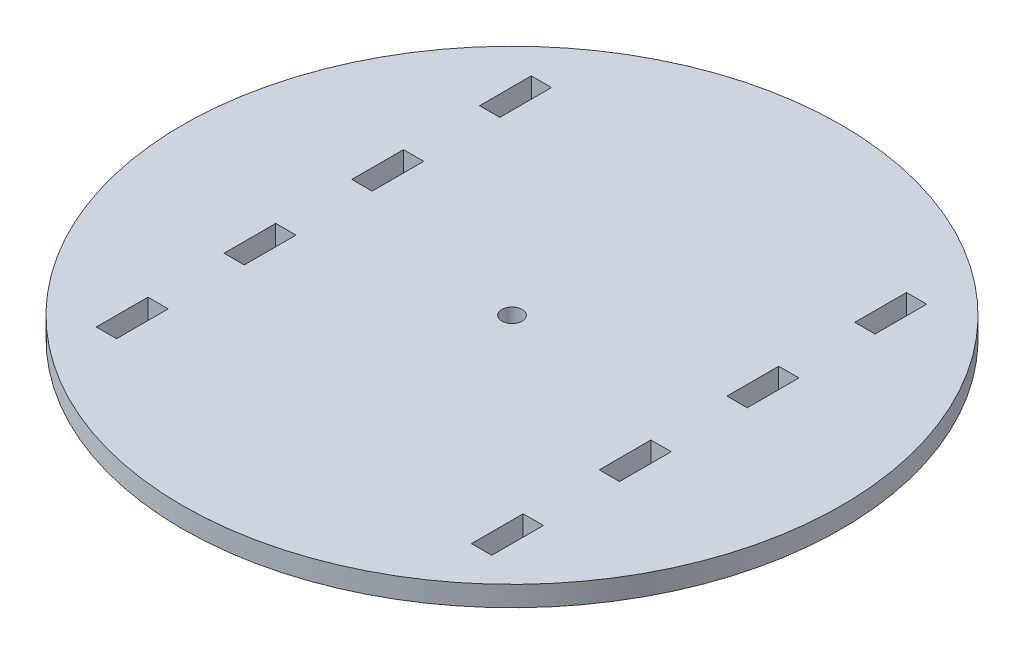
ISO-10303-21;
HEADER;
FILE_DESCRIPTION(('STEP AP214'),'2;1');
FILE_NAME('part.step','',(''),(''),'','','');
FILE_SCHEMA(('AUTOMOTIVE_DESIGN { 1 0 10303 214 1 1 1 1 }'));
ENDSEC;
DATA;
#1=APPLICATION_CONTEXT('core data for automotive mechanical design processes');
#2=APPLICATION_PROTOCOL_DEFINITION('international standard','automotive_design',2000,#1);
#3=PRODUCT_CONTEXT('',#1,'mechanical');
#4=PRODUCT('Part','Part','',(#3));
#5=PRODUCT_RELATED_PRODUCT_CATEGORY('part','',(#4));
#6=PRODUCT_DEFINITION_FORMATION('','',#4);
#7=PRODUCT_DEFINITION_CONTEXT('part definition',#1,'design');
#8=PRODUCT_DEFINITION('design','',#6,#7);
#9=PRODUCT_DEFINITION_SHAPE('','',#8);
#10=(LENGTH_UNIT() NAMED_UNIT(*) SI_UNIT(.MILLI.,.METRE.));
#11=(NAMED_UNIT(*) PLANE_ANGLE_UNIT() SI_UNIT($,.RADIAN.));
#12=(NAMED_UNIT(*) SI_UNIT($,.STERADIAN.) SOLID_ANGLE_UNIT());
#13=UNCERTAINTY_MEASURE_WITH_UNIT(LENGTH_MEASURE(1.E-05),#10,'distance_accuracy_value','');
#14=(GEOMETRIC_REPRESENTATION_CONTEXT(3) GLOBAL_UNCERTAINTY_ASSIGNED_CONTEXT((#13)) GLOBAL_UNIT_ASSIGNED_CONTEXT((#10,
#11,#12)) REPRESENTATION_CONTEXT('',''));
#15=CARTESIAN_POINT('',(0.,0.,0.));
#16=DIRECTION('',(0.,0.,1.));
#17=DIRECTION('',(1.,0.,0.));
#18=AXIS2_PLACEMENT_3D('',#15,#16,#17);
#19=CARTESIAN_POINT('',(0.,4.,0.));
#20=DIRECTION('',(0.,-1.,0.));
#21=DIRECTION('',(0.,0.,-1.));
#22=AXIS2_PLACEMENT_3D('',#19,#20,#21);
#23=CYLINDRICAL_SURFACE('',#22,65.);
#24=CARTESIAN_POINT('',(0.,4.,0.));
#25=DIRECTION('',(0.,1.,0.));
#26=DIRECTION('',(0.,0.,1.));
#27=AXIS2_PLACEMENT_3D('',#24,#25,#26);
#28=CIRCLE('',#27,65.);
#29=CARTESIAN_POINT('',(0.,4.,65.));
#30=VERTEX_POINT('',#29);
#31=EDGE_CURVE('E11',#30,#30,#28,.T.);
#32=ORIENTED_EDGE('',*,*,#31,.F.);
#33=EDGE_LOOP('',(#32));
#34=FACE_BOUND('',#33,.T.);
#35=CARTESIAN_POINT('',(0.,0.,0.));
#36=DIRECTION('',(0.,1.,0.));
#37=DIRECTION('',(0.,0.,1.));
#38=AXIS2_PLACEMENT_3D('',#35,#36,#37);
#39=CIRCLE('',#38,65.);
#40=CARTESIAN_POINT('',(0.,0.,65.));
#41=VERTEX_POINT('',#40);
#42=EDGE_CURVE('E47',#41,#41,#39,.T.);
#43=ORIENTED_EDGE('',*,*,#42,.T.);
#44=EDGE_LOOP('',(#43));
#45=FACE_BOUND('',#44,.T.);
#46=ADVANCED_FACE('F38',(#34,#45),#23,.T.);
#47=CARTESIAN_POINT('',(0.,4.,0.));
#48=DIRECTION('',(0.,1.,0.));
#49=DIRECTION('',(0.,0.,1.));
#50=AXIS2_PLACEMENT_3D('',#47,#48,#49);
#51=PLANE('',#50);
#52=CARTESIAN_POINT('',(0.,4.,0.));
#53=DIRECTION('',(0.,1.,0.));
#54=DIRECTION('',(0.,0.,1.));
#55=AXIS2_PLACEMENT_3D('',#52,#53,#54);
#56=CIRCLE('',#55,2.);
#57=CARTESIAN_POINT('',(0.,4.,2.));
#58=VERTEX_POINT('',#57);
#59=EDGE_CURVE('E959',#58,#58,#56,.T.);
#60=ORIENTED_EDGE('',*,*,#59,.F.);
#61=EDGE_LOOP('',(#60));
#62=FACE_BOUND('',#61,.T.);
#63=DIRECTION('',(0.,0.,1.));
#64=VECTOR('',#63,1.);
#65=CARTESIAN_POINT('',(-39.,4.,17.8));
#66=LINE('',#65,#64);
#67=CARTESIAN_POINT('',(-39.,4.,7.60000000000001));
#68=VERTEX_POINT('',#67);
#69=CARTESIAN_POINT('',(-39.,4.,17.8));
#70=VERTEX_POINT('',#69);
#71=EDGE_CURVE('E55',#68,#70,#66,.T.);
#72=ORIENTED_EDGE('',*,*,#71,.F.);
#73=DIRECTION('',(-1.,0.,0.));
#74=VECTOR('',#73,1.);
#75=CARTESIAN_POINT('',(-39.,4.,7.60000000000001));
#76=LINE('',#75,#74);
#77=CARTESIAN_POINT('',(-35.,4.,7.60000000000001));
#78=VERTEX_POINT('',#77);
#79=EDGE_CURVE('E412',#78,#68,#76,.T.);
#80=ORIENTED_EDGE('',*,*,#79,.F.);
#81=DIRECTION('',(0.,0.,-1.));
#82=VECTOR('',#81,1.);
#83=CARTESIAN_POINT('',(-35.,4.,7.60000000000001));
#84=LINE('',#83,#82);
#85=CARTESIAN_POINT('',(-35.,4.,17.8));
#86=VERTEX_POINT('',#85);
#87=EDGE_CURVE('E408',#86,#78,#84,.T.);
#88=ORIENTED_EDGE('',*,*,#87,.F.);
#89=DIRECTION('',(1.,0.,0.));
#90=VECTOR('',#89,1.);
#91=CARTESIAN_POINT('',(-35.,4.,17.8));
#92=LINE('',#91,#90);
#93=EDGE_CURVE('E404',#70,#86,#92,.T.);
#94=ORIENTED_EDGE('',*,*,#93,.F.);
#95=EDGE_LOOP('',(#72,#80,#88,#94));
#96=FACE_BOUND('',#95,.T.);
#97=DIRECTION('',(0.,0.,1.));
#98=VECTOR('',#97,1.);
#99=CARTESIAN_POINT('',(-39.,4.,43.));
#100=LINE('',#99,#98);
#101=CARTESIAN_POINT('',(-39.,4.,32.8));
#102=VERTEX_POINT('',#101);
#103=CARTESIAN_POINT('',(-39.,4.,43.));
#104=VERTEX_POINT('',#103);
#105=EDGE_CURVE('E63',#102,#104,#100,.T.);
#106=ORIENTED_EDGE('',*,*,#105,.F.);
#107=DIRECTION('',(-1.,0.,0.));
#108=VECTOR('',#107,1.);
#109=CARTESIAN_POINT('',(-39.,4.,32.8));
#110=LINE('',#109,#108);
#111=CARTESIAN_POINT('',(-35.,4.,32.8));
#112=VERTEX_POINT('',#111);
#113=EDGE_CURVE('E455',#112,#102,#110,.T.);
#114=ORIENTED_EDGE('',*,*,#113,.F.);
#115=DIRECTION('',(0.,0.,-1.));
#116=VECTOR('',#115,1.);
#117=CARTESIAN_POINT('',(-35.,4.,32.8));
#118=LINE('',#117,#116);
#119=CARTESIAN_POINT('',(-35.,4.,43.));
#120=VERTEX_POINT('',#119);
#121=EDGE_CURVE('E451',#120,#112,#118,.T.);
#122=ORIENTED_EDGE('',*,*,#121,.F.);
#123=DIRECTION('',(1.,0.,0.));
#124=VECTOR('',#123,1.);
#125=CARTESIAN_POINT('',(-35.,4.,43.));
#126=LINE('',#125,#124);
#127=EDGE_CURVE('E447',#104,#120,#126,.T.);
#128=ORIENTED_EDGE('',*,*,#127,.F.);
#129=EDGE_LOOP('',(#106,#114,#122,#128));
#130=FACE_BOUND('',#129,.T.);
#131=DIRECTION('',(0.,0.,1.));
#132=VECTOR('',#131,1.);
#133=CARTESIAN_POINT('',(-39.,4.,-32.6));
#134=LINE('',#133,#132);
#135=CARTESIAN_POINT('',(-39.,4.,-42.8));
#136=VERTEX_POINT('',#135);
#137=CARTESIAN_POINT('',(-39.,4.,-32.6));
#138=VERTEX_POINT('',#137);
#139=EDGE_CURVE('E486',#136,#138,#134,.T.);
#140=ORIENTED_EDGE('',*,*,#139,.F.);
#141=DIRECTION('',(-1.,0.,0.));
#142=VECTOR('',#141,1.);
#143=CARTESIAN_POINT('',(-39.,4.,-42.8));
#144=LINE('',#143,#142);
#145=CARTESIAN_POINT('',(-35.,4.,-42.8));
#146=VERTEX_POINT('',#145);
#147=EDGE_CURVE('E497',#146,#136,#144,.T.);
#148=ORIENTED_EDGE('',*,*,#147,.F.);
#149=DIRECTION('',(0.,0.,-1.));
#150=VECTOR('',#149,1.);
#151=CARTESIAN_POINT('',(-35.,4.,-42.8));
#152=LINE('',#151,#150);
#153=CARTESIAN_POINT('',(-35.,4.,-32.6));
#154=VERTEX_POINT('',#153);
#155=EDGE_CURVE('E493',#154,#146,#152,.T.);
#156=ORIENTED_EDGE('',*,*,#155,.F.);
#157=DIRECTION('',(1.,0.,0.));
#158=VECTOR('',#157,1.);
#159=CARTESIAN_POINT('',(-35.,4.,-32.6));
#160=LINE('',#159,#158);
#161=EDGE_CURVE('E489',#138,#154,#160,.T.);
#162=ORIENTED_EDGE('',*,*,#161,.F.);
#163=EDGE_LOOP('',(#140,#148,#156,#162));
#164=FACE_BOUND('',#163,.T.);
#165=DIRECTION('',(0.,0.,1.));
#166=VECTOR('',#165,1.);
#167=CARTESIAN_POINT('',(35.,4.,-42.8));
#168=LINE('',#167,#166);
#169=CARTESIAN_POINT('',(35.,4.,-42.8));
#170=VERTEX_POINT('',#169);
#171=CARTESIAN_POINT('',(35.,4.,-32.6));
#172=VERTEX_POINT('',#171);
#173=EDGE_CURVE('E527',#170,#172,#168,.T.);
#174=ORIENTED_EDGE('',*,*,#173,.F.);
#175=DIRECTION('',(-1.,0.,0.));
#176=VECTOR('',#175,1.);
#177=CARTESIAN_POINT('',(39.,4.,-42.8));
#178=LINE('',#177,#176);
#179=CARTESIAN_POINT('',(39.,4.,-42.8));
#180=VERTEX_POINT('',#179);
#181=EDGE_CURVE('E538',#180,#170,#178,.T.);
#182=ORIENTED_EDGE('',*,*,#181,.F.);
#183=DIRECTION('',(0.,0.,-1.));
#184=VECTOR('',#183,1.);
#185=CARTESIAN_POINT('',(39.,4.,-32.6));
#186=LINE('',#185,#184);
#187=CARTESIAN_POINT('',(39.,4.,-32.6));
#188=VERTEX_POINT('',#187);
#189=EDGE_CURVE('E534',#188,#180,#186,.T.);
#190=ORIENTED_EDGE('',*,*,#189,.F.);
#191=DIRECTION('',(1.,0.,0.));
#192=VECTOR('',#191,1.);
#193=CARTESIAN_POINT('',(35.,4.,-32.6));
#194=LINE('',#193,#192);
#195=EDGE_CURVE('E530',#172,#188,#194,.T.);
#196=ORIENTED_EDGE('',*,*,#195,.F.);
#197=EDGE_LOOP('',(#174,#182,#190,#196));
#198=FACE_BOUND('',#197,.T.);
#199=DIRECTION('',(0.,0.,1.));
#200=VECTOR('',#199,1.);
#201=CARTESIAN_POINT('',(35.,4.,-7.39999999999999));
#202=LINE('',#201,#200);
#203=CARTESIAN_POINT('',(35.,4.,-17.6));
#204=VERTEX_POINT('',#203);
#205=CARTESIAN_POINT('',(35.,4.,-7.39999999999999));
#206=VERTEX_POINT('',#205);
#207=EDGE_CURVE('E256',#204,#206,#202,.T.);
#208=ORIENTED_EDGE('',*,*,#207,.F.);
#209=DIRECTION('',(-1.,0.,0.));
#210=VECTOR('',#209,1.);
#211=CARTESIAN_POINT('',(35.,4.,-17.6));
#212=LINE('',#211,#210);
#213=CARTESIAN_POINT('',(39.,4.,-17.6));
#214=VERTEX_POINT('',#213);
#215=EDGE_CURVE('E262',#214,#204,#212,.T.);
#216=ORIENTED_EDGE('',*,*,#215,.F.);
#217=DIRECTION('',(0.,0.,-1.));
#218=VECTOR('',#217,1.);
#219=CARTESIAN_POINT('',(39.,4.,-17.6));
#220=LINE('',#219,#218);
#221=CARTESIAN_POINT('',(39.,4.,-7.39999999999999));
#222=VERTEX_POINT('',#221);
#223=EDGE_CURVE('E290',#222,#214,#220,.T.);
#224=ORIENTED_EDGE('',*,*,#223,.F.);
#225=DIRECTION('',(1.,0.,0.));
#226=VECTOR('',#225,1.);
#227=CARTESIAN_POINT('',(39.,4.,-7.39999999999999));
#228=LINE('',#227,#226);
#229=EDGE_CURVE('E282',#206,#222,#228,.T.);
#230=ORIENTED_EDGE('',*,*,#229,.F.);
#231=EDGE_LOOP('',(#208,#216,#224,#230));
#232=FACE_BOUND('',#231,.T.);
#233=DIRECTION('',(0.,0.,1.));
#234=VECTOR('',#233,1.);
#235=CARTESIAN_POINT('',(35.,4.,7.60000000000001));
#236=LINE('',#235,#234);
#237=CARTESIAN_POINT('',(35.,4.,7.60000000000001));
#238=VERTEX_POINT('',#237);
#239=CARTESIAN_POINT('',(35.,4.,17.8));
#240=VERTEX_POINT('',#239);
#241=EDGE_CURVE('E316',#238,#240,#236,.T.);
#242=ORIENTED_EDGE('',*,*,#241,.F.);
#243=DIRECTION('',(-1.,0.,0.));
#244=VECTOR('',#243,1.);
#245=CARTESIAN_POINT('',(39.,4.,7.60000000000001));
#246=LINE('',#245,#244);
#247=CARTESIAN_POINT('',(39.,4.,7.60000000000001));
#248=VERTEX_POINT('',#247);
#249=EDGE_CURVE('E327',#248,#238,#246,.T.);
#250=ORIENTED_EDGE('',*,*,#249,.F.);
#251=DIRECTION('',(0.,0.,-1.));
#252=VECTOR('',#251,1.);
#253=CARTESIAN_POINT('',(39.,4.,17.8));
#254=LINE('',#253,#252);
#255=CARTESIAN_POINT('',(39.,4.,17.8));
#256=VERTEX_POINT('',#255);
#257=EDGE_CURVE('E323',#256,#248,#254,.T.);
#258=ORIENTED_EDGE('',*,*,#257,.F.);
#259=DIRECTION('',(1.,0.,0.));
#260=VECTOR('',#259,1.);
#261=CARTESIAN_POINT('',(35.,4.,17.8));
#262=LINE('',#261,#260);
#263=EDGE_CURVE('E319',#240,#256,#262,.T.);
#264=ORIENTED_EDGE('',*,*,#263,.F.);
#265=EDGE_LOOP('',(#242,#250,#258,#264));
#266=FACE_BOUND('',#265,.T.);
#267=DIRECTION('',(0.,0.,1.));
#268=VECTOR('',#267,1.);
#269=CARTESIAN_POINT('',(35.,4.,32.8));
#270=LINE('',#269,#268);
#271=CARTESIAN_POINT('',(35.,4.,32.8));
#272=VERTEX_POINT('',#271);
#273=CARTESIAN_POINT('',(35.,4.,43.));
#274=VERTEX_POINT('',#273);
#275=EDGE_CURVE('E359',#272,#274,#270,.T.);
#276=ORIENTED_EDGE('',*,*,#275,.F.);
#277=DIRECTION('',(-1.,0.,0.));
#278=VECTOR('',#277,1.);
#279=CARTESIAN_POINT('',(39.,4.,32.8));
#280=LINE('',#279,#278);
#281=CARTESIAN_POINT('',(39.,4.,32.8));
#282=VERTEX_POINT('',#281);
#283=EDGE_CURVE('E370',#282,#272,#280,.T.);
#284=ORIENTED_EDGE('',*,*,#283,.F.);
#285=DIRECTION('',(0.,0.,-1.));
#286=VECTOR('',#285,1.);
#287=CARTESIAN_POINT('',(39.,4.,43.));
#288=LINE('',#287,#286);
#289=CARTESIAN_POINT('',(39.,4.,43.));
#290=VERTEX_POINT('',#289);
#291=EDGE_CURVE('E366',#290,#282,#288,.T.);
#292=ORIENTED_EDGE('',*,*,#291,.F.);
#293=DIRECTION('',(1.,0.,0.));
#294=VECTOR('',#293,1.);
#295=CARTESIAN_POINT('',(35.,4.,43.));
#296=LINE('',#295,#294);
#297=EDGE_CURVE('E362',#274,#290,#296,.T.);
#298=ORIENTED_EDGE('',*,*,#297,.F.);
#299=EDGE_LOOP('',(#276,#284,#292,#298));
#300=FACE_BOUND('',#299,.T.);
#301=DIRECTION('',(0.,0.,1.));
#302=VECTOR('',#301,1.);
#303=CARTESIAN_POINT('',(-39.,4.,-17.6));
#304=LINE('',#303,#302);
#305=CARTESIAN_POINT('',(-39.,4.,-17.6));
#306=VERTEX_POINT('',#305);
#307=CARTESIAN_POINT('',(-39.,4.,-7.39999999999999));
#308=VERTEX_POINT('',#307);
#309=EDGE_CURVE('E568',#306,#308,#304,.T.);
#310=ORIENTED_EDGE('',*,*,#309,.F.);
#311=DIRECTION('',(-1.,0.,0.));
#312=VECTOR('',#311,1.);
#313=CARTESIAN_POINT('',(-35.,4.,-17.6));
#314=LINE('',#313,#312);
#315=CARTESIAN_POINT('',(-35.,4.,-17.6));
#316=VERTEX_POINT('',#315);
#317=EDGE_CURVE('E579',#316,#306,#314,.T.);
#318=ORIENTED_EDGE('',*,*,#317,.F.);
#319=DIRECTION('',(0.,0.,-1.));
#320=VECTOR('',#319,1.);
#321=CARTESIAN_POINT('',(-35.,4.,-7.39999999999999));
#322=LINE('',#321,#320);
#323=CARTESIAN_POINT('',(-35.,4.,-7.39999999999999));
#324=VERTEX_POINT('',#323);
#325=EDGE_CURVE('E575',#324,#316,#322,.T.);
#326=ORIENTED_EDGE('',*,*,#325,.F.);
#327=DIRECTION('',(1.,0.,0.));
#328=VECTOR('',#327,1.);
#329=CARTESIAN_POINT('',(-39.,4.,-7.39999999999999));
#330=LINE('',#329,#328);
#331=EDGE_CURVE('E571',#308,#324,#330,.T.);
#332=ORIENTED_EDGE('',*,*,#331,.F.);
#333=EDGE_LOOP('',(#310,#318,#326,#332));
#334=FACE_BOUND('',#333,.T.);
#335=ORIENTED_EDGE('',*,*,#31,.T.);
#336=EDGE_LOOP('',(#335));
#337=FACE_BOUND('',#336,.T.);
#338=ADVANCED_FACE('F606',(#62,#96,#130,#164,#198,#232,#266,#300,#334,#337),#51,.T.);
#339=CARTESIAN_POINT('',(0.,0.,0.));
#340=DIRECTION('',(0.,1.,0.));
#341=DIRECTION('',(0.,0.,1.));
#342=AXIS2_PLACEMENT_3D('',#339,#340,#341);
#343=PLANE('',#342);
#344=CARTESIAN_POINT('',(0.,0.,0.));
#345=DIRECTION('',(0.,1.,0.));
#346=DIRECTION('',(0.,0.,1.));
#347=AXIS2_PLACEMENT_3D('',#344,#345,#346);
#348=CIRCLE('',#347,2.);
#349=CARTESIAN_POINT('',(0.,0.,2.));
#350=VERTEX_POINT('',#349);
#351=EDGE_CURVE('E41',#350,#350,#348,.T.);
#352=ORIENTED_EDGE('',*,*,#351,.T.);
#353=EDGE_LOOP('',(#352));
#354=FACE_BOUND('',#353,.T.);
#355=DIRECTION('',(1.,0.,0.));
#356=VECTOR('',#355,1.);
#357=CARTESIAN_POINT('',(-39.,0.,7.60000000000001));
#358=LINE('',#357,#356);
#359=CARTESIAN_POINT('',(-39.,0.,7.60000000000001));
#360=VERTEX_POINT('',#359);
#361=CARTESIAN_POINT('',(-35.,0.,7.60000000000001));
#362=VERTEX_POINT('',#361);
#363=EDGE_CURVE('E393',#360,#362,#358,.T.);
#364=ORIENTED_EDGE('',*,*,#363,.F.);
#365=DIRECTION('',(0.,0.,-1.));
#366=VECTOR('',#365,1.);
#367=CARTESIAN_POINT('',(-39.,0.,17.8));
#368=LINE('',#367,#366);
#369=CARTESIAN_POINT('',(-39.,0.,17.8));
#370=VERTEX_POINT('',#369);
#371=EDGE_CURVE('E398',#370,#360,#368,.T.);
#372=ORIENTED_EDGE('',*,*,#371,.F.);
#373=DIRECTION('',(-1.,0.,0.));
#374=VECTOR('',#373,1.);
#375=CARTESIAN_POINT('',(-35.,0.,17.8));
#376=LINE('',#375,#374);
#377=CARTESIAN_POINT('',(-35.,0.,17.8));
#378=VERTEX_POINT('',#377);
#379=EDGE_CURVE('E420',#378,#370,#376,.T.);
#380=ORIENTED_EDGE('',*,*,#379,.F.);
#381=DIRECTION('',(0.,0.,1.));
#382=VECTOR('',#381,1.);
#383=CARTESIAN_POINT('',(-35.,0.,7.60000000000001));
#384=LINE('',#383,#382);
#385=EDGE_CURVE('E390',#362,#378,#384,.T.);
#386=ORIENTED_EDGE('',*,*,#385,.F.);
#387=EDGE_LOOP('',(#364,#372,#380,#386));
#388=FACE_BOUND('',#387,.T.);
#389=DIRECTION('',(1.,0.,0.));
#390=VECTOR('',#389,1.);
#391=CARTESIAN_POINT('',(-39.,0.,32.8));
#392=LINE('',#391,#390);
#393=CARTESIAN_POINT('',(-39.,0.,32.8));
#394=VERTEX_POINT('',#393);
#395=CARTESIAN_POINT('',(-35.,0.,32.8));
#396=VERTEX_POINT('',#395);
#397=EDGE_CURVE('E436',#394,#396,#392,.T.);
#398=ORIENTED_EDGE('',*,*,#397,.F.);
#399=DIRECTION('',(0.,0.,-1.));
#400=VECTOR('',#399,1.);
#401=CARTESIAN_POINT('',(-39.,0.,43.));
#402=LINE('',#401,#400);
#403=CARTESIAN_POINT('',(-39.,0.,43.));
#404=VERTEX_POINT('',#403);
#405=EDGE_CURVE('E441',#404,#394,#402,.T.);
#406=ORIENTED_EDGE('',*,*,#405,.F.);
#407=DIRECTION('',(-1.,0.,0.));
#408=VECTOR('',#407,1.);
#409=CARTESIAN_POINT('',(-35.,0.,43.));
#410=LINE('',#409,#408);
#411=CARTESIAN_POINT('',(-35.,0.,43.));
#412=VERTEX_POINT('',#411);
#413=EDGE_CURVE('E394',#412,#404,#410,.T.);
#414=ORIENTED_EDGE('',*,*,#413,.F.);
#415=DIRECTION('',(0.,0.,1.));
#416=VECTOR('',#415,1.);
#417=CARTESIAN_POINT('',(-35.,0.,32.8));
#418=LINE('',#417,#416);
#419=EDGE_CURVE('E433',#396,#412,#418,.T.);
#420=ORIENTED_EDGE('',*,*,#419,.F.);
#421=EDGE_LOOP('',(#398,#406,#414,#420));
#422=FACE_BOUND('',#421,.T.);
#423=DIRECTION('',(1.,0.,0.));
#424=VECTOR('',#423,1.);
#425=CARTESIAN_POINT('',(-39.,0.,-42.8));
#426=LINE('',#425,#424);
#427=CARTESIAN_POINT('',(-39.,0.,-42.8));
#428=VERTEX_POINT('',#427);
#429=CARTESIAN_POINT('',(-35.,0.,-42.8));
#430=VERTEX_POINT('',#429);
#431=EDGE_CURVE('E477',#428,#430,#426,.T.);
#432=ORIENTED_EDGE('',*,*,#431,.F.);
#433=DIRECTION('',(0.,0.,-1.));
#434=VECTOR('',#433,1.);
#435=CARTESIAN_POINT('',(-39.,0.,-32.6));
#436=LINE('',#435,#434);
#437=CARTESIAN_POINT('',(-39.,0.,-32.6));
#438=VERTEX_POINT('',#437);
#439=EDGE_CURVE('E482',#438,#428,#436,.T.);
#440=ORIENTED_EDGE('',*,*,#439,.F.);
#441=DIRECTION('',(-1.,0.,0.));
#442=VECTOR('',#441,1.);
#443=CARTESIAN_POINT('',(-35.,0.,-32.6));
#444=LINE('',#443,#442);
#445=CARTESIAN_POINT('',(-35.,0.,-32.6));
#446=VERTEX_POINT('',#445);
#447=EDGE_CURVE('E437',#446,#438,#444,.T.);
#448=ORIENTED_EDGE('',*,*,#447,.F.);
#449=DIRECTION('',(0.,0.,1.));
#450=VECTOR('',#449,1.);
#451=CARTESIAN_POINT('',(-35.,0.,-42.8));
#452=LINE('',#451,#450);
#453=EDGE_CURVE('E474',#430,#446,#452,.T.);
#454=ORIENTED_EDGE('',*,*,#453,.F.);
#455=EDGE_LOOP('',(#432,#440,#448,#454));
#456=FACE_BOUND('',#455,.T.);
#457=DIRECTION('',(1.,0.,0.));
#458=VECTOR('',#457,1.);
#459=CARTESIAN_POINT('',(39.,0.,-42.8));
#460=LINE('',#459,#458);
#461=CARTESIAN_POINT('',(35.,0.,-42.8));
#462=VERTEX_POINT('',#461);
#463=CARTESIAN_POINT('',(39.,0.,-42.8));
#464=VERTEX_POINT('',#463);
#465=EDGE_CURVE('E519',#462,#464,#460,.T.);
#466=ORIENTED_EDGE('',*,*,#465,.F.);
#467=DIRECTION('',(0.,0.,-1.));
#468=VECTOR('',#467,1.);
#469=CARTESIAN_POINT('',(35.,0.,-42.8));
#470=LINE('',#469,#468);
#471=CARTESIAN_POINT('',(35.,0.,-32.6));
#472=VERTEX_POINT('',#471);
#473=EDGE_CURVE('E523',#472,#462,#470,.T.);
#474=ORIENTED_EDGE('',*,*,#473,.F.);
#475=DIRECTION('',(-1.,0.,0.));
#476=VECTOR('',#475,1.);
#477=CARTESIAN_POINT('',(35.,0.,-32.6));
#478=LINE('',#477,#476);
#479=CARTESIAN_POINT('',(39.,0.,-32.6));
#480=VERTEX_POINT('',#479);
#481=EDGE_CURVE('E478',#480,#472,#478,.T.);
#482=ORIENTED_EDGE('',*,*,#481,.F.);
#483=DIRECTION('',(0.,0.,1.));
#484=VECTOR('',#483,1.);
#485=CARTESIAN_POINT('',(39.,0.,-32.6));
#486=LINE('',#485,#484);
#487=EDGE_CURVE('E271',#464,#480,#486,.T.);
#488=ORIENTED_EDGE('',*,*,#487,.F.);
#489=EDGE_LOOP('',(#466,#474,#482,#488));
#490=FACE_BOUND('',#489,.T.);
#491=DIRECTION('',(1.,0.,0.));
#492=VECTOR('',#491,1.);
#493=CARTESIAN_POINT('',(35.,0.,-17.6));
#494=LINE('',#493,#492);
#495=CARTESIAN_POINT('',(35.,0.,-17.6));
#496=VERTEX_POINT('',#495);
#497=CARTESIAN_POINT('',(39.,0.,-17.6));
#498=VERTEX_POINT('',#497);
#499=EDGE_CURVE('E277',#496,#498,#494,.T.);
#500=ORIENTED_EDGE('',*,*,#499,.F.);
#501=DIRECTION('',(0.,0.,-1.));
#502=VECTOR('',#501,1.);
#503=CARTESIAN_POINT('',(35.,0.,-7.39999999999999));
#504=LINE('',#503,#502);
#505=CARTESIAN_POINT('',(35.,0.,-7.39999999999999));
#506=VERTEX_POINT('',#505);
#507=EDGE_CURVE('E253',#506,#496,#504,.T.);
#508=ORIENTED_EDGE('',*,*,#507,.F.);
#509=DIRECTION('',(-1.,0.,0.));
#510=VECTOR('',#509,1.);
#511=CARTESIAN_POINT('',(39.,0.,-7.39999999999999));
#512=LINE('',#511,#510);
#513=CARTESIAN_POINT('',(39.,0.,-7.39999999999999));
#514=VERTEX_POINT('',#513);
#515=EDGE_CURVE('E266',#514,#506,#512,.T.);
#516=ORIENTED_EDGE('',*,*,#515,.F.);
#517=DIRECTION('',(0.,0.,1.));
#518=VECTOR('',#517,1.);
#519=CARTESIAN_POINT('',(39.,0.,-17.6));
#520=LINE('',#519,#518);
#521=EDGE_CURVE('E284',#498,#514,#520,.T.);
#522=ORIENTED_EDGE('',*,*,#521,.F.);
#523=EDGE_LOOP('',(#500,#508,#516,#522));
#524=FACE_BOUND('',#523,.T.);
#525=DIRECTION('',(1.,0.,0.));
#526=VECTOR('',#525,1.);
#527=CARTESIAN_POINT('',(39.,0.,7.60000000000001));
#528=LINE('',#527,#526);
#529=CARTESIAN_POINT('',(35.,0.,7.60000000000001));
#530=VERTEX_POINT('',#529);
#531=CARTESIAN_POINT('',(39.,0.,7.60000000000001));
#532=VERTEX_POINT('',#531);
#533=EDGE_CURVE('E307',#530,#532,#528,.T.);
#534=ORIENTED_EDGE('',*,*,#533,.F.);
#535=DIRECTION('',(0.,0.,-1.));
#536=VECTOR('',#535,1.);
#537=CARTESIAN_POINT('',(35.,0.,7.60000000000001));
#538=LINE('',#537,#536);
#539=CARTESIAN_POINT('',(35.,0.,17.8));
#540=VERTEX_POINT('',#539);
#541=EDGE_CURVE('E312',#540,#530,#538,.T.);
#542=ORIENTED_EDGE('',*,*,#541,.F.);
#543=DIRECTION('',(-1.,0.,0.));
#544=VECTOR('',#543,1.);
#545=CARTESIAN_POINT('',(35.,0.,17.8));
#546=LINE('',#545,#544);
#547=CARTESIAN_POINT('',(39.,0.,17.8));
#548=VERTEX_POINT('',#547);
#549=EDGE_CURVE('E335',#548,#540,#546,.T.);
#550=ORIENTED_EDGE('',*,*,#549,.F.);
#551=DIRECTION('',(0.,0.,1.));
#552=VECTOR('',#551,1.);
#553=CARTESIAN_POINT('',(39.,0.,17.8));
#554=LINE('',#553,#552);
#555=EDGE_CURVE('E304',#532,#548,#554,.T.);
#556=ORIENTED_EDGE('',*,*,#555,.F.);
#557=EDGE_LOOP('',(#534,#542,#550,#556));
#558=FACE_BOUND('',#557,.T.);
#559=DIRECTION('',(1.,0.,0.));
#560=VECTOR('',#559,1.);
#561=CARTESIAN_POINT('',(39.,0.,32.8));
#562=LINE('',#561,#560);
#563=CARTESIAN_POINT('',(35.,0.,32.8));
#564=VERTEX_POINT('',#563);
#565=CARTESIAN_POINT('',(39.,0.,32.8));
#566=VERTEX_POINT('',#565);
#567=EDGE_CURVE('E351',#564,#566,#562,.T.);
#568=ORIENTED_EDGE('',*,*,#567,.F.);
#569=DIRECTION('',(0.,0.,-1.));
#570=VECTOR('',#569,1.);
#571=CARTESIAN_POINT('',(35.,0.,32.8));
#572=LINE('',#571,#570);
#573=CARTESIAN_POINT('',(35.,0.,43.));
#574=VERTEX_POINT('',#573);
#575=EDGE_CURVE('E355',#574,#564,#572,.T.);
#576=ORIENTED_EDGE('',*,*,#575,.F.);
#577=DIRECTION('',(-1.,0.,0.));
#578=VECTOR('',#577,1.);
#579=CARTESIAN_POINT('',(35.,0.,43.));
#580=LINE('',#579,#578);
#581=CARTESIAN_POINT('',(39.,0.,43.));
#582=VERTEX_POINT('',#581);
#583=EDGE_CURVE('E308',#582,#574,#580,.T.);
#584=ORIENTED_EDGE('',*,*,#583,.F.);
#585=DIRECTION('',(0.,0.,1.));
#586=VECTOR('',#585,1.);
#587=CARTESIAN_POINT('',(39.,0.,43.));
#588=LINE('',#587,#586);
#589=EDGE_CURVE('E348',#566,#582,#588,.T.);
#590=ORIENTED_EDGE('',*,*,#589,.F.);
#591=EDGE_LOOP('',(#568,#576,#584,#590));
#592=FACE_BOUND('',#591,.T.);
#593=DIRECTION('',(1.,0.,0.));
#594=VECTOR('',#593,1.);
#595=CARTESIAN_POINT('',(-35.,0.,-17.6));
#596=LINE('',#595,#594);
#597=CARTESIAN_POINT('',(-39.,0.,-17.6));
#598=VERTEX_POINT('',#597);
#599=CARTESIAN_POINT('',(-35.,0.,-17.6));
#600=VERTEX_POINT('',#599);
#601=EDGE_CURVE('E560',#598,#600,#596,.T.);
#602=ORIENTED_EDGE('',*,*,#601,.F.);
#603=DIRECTION('',(0.,0.,-1.));
#604=VECTOR('',#603,1.);
#605=CARTESIAN_POINT('',(-39.,0.,-17.6));
#606=LINE('',#605,#604);
#607=CARTESIAN_POINT('',(-39.,0.,-7.39999999999999));
#608=VERTEX_POINT('',#607);
#609=EDGE_CURVE('E564',#608,#598,#606,.T.);
#610=ORIENTED_EDGE('',*,*,#609,.F.);
#611=DIRECTION('',(-1.,0.,0.));
#612=VECTOR('',#611,1.);
#613=CARTESIAN_POINT('',(-39.,0.,-7.39999999999999));
#614=LINE('',#613,#612);
#615=CARTESIAN_POINT('',(-35.,0.,-7.39999999999999));
#616=VERTEX_POINT('',#615);
#617=EDGE_CURVE('E587',#616,#608,#614,.T.);
#618=ORIENTED_EDGE('',*,*,#617,.F.);
#619=DIRECTION('',(0.,0.,1.));
#620=VECTOR('',#619,1.);
#621=CARTESIAN_POINT('',(-35.,0.,-7.39999999999999));
#622=LINE('',#621,#620);
#623=EDGE_CURVE('E432',#600,#616,#622,.T.);
#624=ORIENTED_EDGE('',*,*,#623,.F.);
#625=EDGE_LOOP('',(#602,#610,#618,#624));
#626=FACE_BOUND('',#625,.T.);
#627=ORIENTED_EDGE('',*,*,#42,.F.);
#628=EDGE_LOOP('',(#627));
#629=FACE_BOUND('',#628,.T.);
#630=ADVANCED_FACE('F274',(#354,#388,#422,#456,#490,#524,#558,#592,#626,#629),#343,.F.);
#631=CARTESIAN_POINT('',(-39.,-0.00100000000000013,-17.6));
#632=DIRECTION('',(-1.,0.,0.));
#633=DIRECTION('',(0.,0.,1.));
#634=AXIS2_PLACEMENT_3D('',#631,#632,#633);
#635=PLANE('',#634);
#636=ORIENTED_EDGE('',*,*,#609,.T.);
#637=DIRECTION('',(0.,1.,0.));
#638=VECTOR('',#637,1.);
#639=CARTESIAN_POINT('',(-39.,-0.00100000000000013,-17.6));
#640=LINE('',#639,#638);
#641=EDGE_CURVE('E584',#598,#306,#640,.T.);
#642=ORIENTED_EDGE('',*,*,#641,.T.);
#643=ORIENTED_EDGE('',*,*,#309,.T.);
#644=DIRECTION('',(0.,1.,0.));
#645=VECTOR('',#644,1.);
#646=CARTESIAN_POINT('',(-39.,-0.00100000000000013,-7.39999999999999));
#647=LINE('',#646,#645);
#648=EDGE_CURVE('E583',#608,#308,#647,.T.);
#649=ORIENTED_EDGE('',*,*,#648,.F.);
#650=EDGE_LOOP('',(#636,#642,#643,#649));
#651=FACE_BOUND('',#650,.T.);
#652=ADVANCED_FACE('F605',(#651),#635,.F.);
#653=CARTESIAN_POINT('',(-35.,-0.00100000000000013,-17.6));
#654=DIRECTION('',(0.,0.,-1.));
#655=DIRECTION('',(-1.,0.,0.));
#656=AXIS2_PLACEMENT_3D('',#653,#654,#655);
#657=PLANE('',#656);
#658=ORIENTED_EDGE('',*,*,#601,.T.);
#659=DIRECTION('',(0.,1.,0.));
#660=VECTOR('',#659,1.);
#661=CARTESIAN_POINT('',(-35.,-0.00100000000000013,-17.6));
#662=LINE('',#661,#660);
#663=EDGE_CURVE('E588',#600,#316,#662,.T.);
#664=ORIENTED_EDGE('',*,*,#663,.T.);
#665=ORIENTED_EDGE('',*,*,#317,.T.);
#666=ORIENTED_EDGE('',*,*,#641,.F.);
#667=EDGE_LOOP('',(#658,#664,#665,#666));
#668=FACE_BOUND('',#667,.T.);
#669=ADVANCED_FACE('F613',(#668),#657,.F.);
#670=CARTESIAN_POINT('',(-35.,-0.00100000000000013,-7.39999999999999));
#671=DIRECTION('',(1.,0.,0.));
#672=DIRECTION('',(0.,0.,-1.));
#673=AXIS2_PLACEMENT_3D('',#670,#671,#672);
#674=PLANE('',#673);
#675=ORIENTED_EDGE('',*,*,#623,.T.);
#676=DIRECTION('',(0.,1.,0.));
#677=VECTOR('',#676,1.);
#678=CARTESIAN_POINT('',(-35.,-0.00100000000000013,-7.39999999999999));
#679=LINE('',#678,#677);
#680=EDGE_CURVE('E591',#616,#324,#679,.T.);
#681=ORIENTED_EDGE('',*,*,#680,.T.);
#682=ORIENTED_EDGE('',*,*,#325,.T.);
#683=ORIENTED_EDGE('',*,*,#663,.F.);
#684=EDGE_LOOP('',(#675,#681,#682,#683));
#685=FACE_BOUND('',#684,.T.);
#686=ADVANCED_FACE('F647',(#685),#674,.F.);
#687=CARTESIAN_POINT('',(-39.,-0.00100000000000013,-7.39999999999999));
#688=DIRECTION('',(0.,0.,1.));
#689=DIRECTION('',(1.,0.,0.));
#690=AXIS2_PLACEMENT_3D('',#687,#688,#689);
#691=PLANE('',#690);
#692=ORIENTED_EDGE('',*,*,#617,.T.);
#693=ORIENTED_EDGE('',*,*,#648,.T.);
#694=ORIENTED_EDGE('',*,*,#331,.T.);
#695=ORIENTED_EDGE('',*,*,#680,.F.);
#696=EDGE_LOOP('',(#692,#693,#694,#695));
#697=FACE_BOUND('',#696,.T.);
#698=ADVANCED_FACE('F655',(#697),#691,.F.);
#699=CARTESIAN_POINT('',(35.,-0.00100000000000013,32.8));
#700=DIRECTION('',(-1.,0.,0.));
#701=DIRECTION('',(0.,0.,1.));
#702=AXIS2_PLACEMENT_3D('',#699,#700,#701);
#703=PLANE('',#702);
#704=ORIENTED_EDGE('',*,*,#575,.T.);
#705=DIRECTION('',(0.,1.,0.));
#706=VECTOR('',#705,1.);
#707=CARTESIAN_POINT('',(35.,-0.00100000000000013,32.8));
#708=LINE('',#707,#706);
#709=EDGE_CURVE('E375',#564,#272,#708,.T.);
#710=ORIENTED_EDGE('',*,*,#709,.T.);
#711=ORIENTED_EDGE('',*,*,#275,.T.);
#712=DIRECTION('',(0.,1.,0.));
#713=VECTOR('',#712,1.);
#714=CARTESIAN_POINT('',(35.,-0.00100000000000013,43.));
#715=LINE('',#714,#713);
#716=EDGE_CURVE('E374',#574,#274,#715,.T.);
#717=ORIENTED_EDGE('',*,*,#716,.F.);
#718=EDGE_LOOP('',(#704,#710,#711,#717));
#719=FACE_BOUND('',#718,.T.);
#720=ADVANCED_FACE('F663',(#719),#703,.F.);
#721=CARTESIAN_POINT('',(39.,-0.00100000000000013,32.8));
#722=DIRECTION('',(0.,0.,-1.));
#723=DIRECTION('',(-1.,0.,0.));
#724=AXIS2_PLACEMENT_3D('',#721,#722,#723);
#725=PLANE('',#724);
#726=ORIENTED_EDGE('',*,*,#567,.T.);
#727=DIRECTION('',(0.,1.,0.));
#728=VECTOR('',#727,1.);
#729=CARTESIAN_POINT('',(39.,-0.00100000000000013,32.8));
#730=LINE('',#729,#728);
#731=EDGE_CURVE('E378',#566,#282,#730,.T.);
#732=ORIENTED_EDGE('',*,*,#731,.T.);
#733=ORIENTED_EDGE('',*,*,#283,.T.);
#734=ORIENTED_EDGE('',*,*,#709,.F.);
#735=EDGE_LOOP('',(#726,#732,#733,#734));
#736=FACE_BOUND('',#735,.T.);
#737=ADVANCED_FACE('F671',(#736),#725,.F.);
#738=CARTESIAN_POINT('',(39.,-0.00100000000000013,43.));
#739=DIRECTION('',(1.,0.,0.));
#740=DIRECTION('',(0.,0.,-1.));
#741=AXIS2_PLACEMENT_3D('',#738,#739,#740);
#742=PLANE('',#741);
#743=ORIENTED_EDGE('',*,*,#589,.T.);
#744=DIRECTION('',(0.,1.,0.));
#745=VECTOR('',#744,1.);
#746=CARTESIAN_POINT('',(39.,-0.00100000000000013,43.));
#747=LINE('',#746,#745);
#748=EDGE_CURVE('E381',#582,#290,#747,.T.);
#749=ORIENTED_EDGE('',*,*,#748,.T.);
#750=ORIENTED_EDGE('',*,*,#291,.T.);
#751=ORIENTED_EDGE('',*,*,#731,.F.);
#752=EDGE_LOOP('',(#743,#749,#750,#751));
#753=FACE_BOUND('',#752,.T.);
#754=ADVANCED_FACE('F679',(#753),#742,.F.);
#755=CARTESIAN_POINT('',(35.,-0.00100000000000013,43.));
#756=DIRECTION('',(0.,0.,1.));
#757=DIRECTION('',(1.,0.,0.));
#758=AXIS2_PLACEMENT_3D('',#755,#756,#757);
#759=PLANE('',#758);
#760=ORIENTED_EDGE('',*,*,#583,.T.);
#761=ORIENTED_EDGE('',*,*,#716,.T.);
#762=ORIENTED_EDGE('',*,*,#297,.T.);
#763=ORIENTED_EDGE('',*,*,#748,.F.);
#764=EDGE_LOOP('',(#760,#761,#762,#763));
#765=FACE_BOUND('',#764,.T.);
#766=ADVANCED_FACE('F687',(#765),#759,.F.);
#767=CARTESIAN_POINT('',(35.,-0.00100000000000013,7.60000000000001));
#768=DIRECTION('',(-1.,0.,0.));
#769=DIRECTION('',(0.,0.,1.));
#770=AXIS2_PLACEMENT_3D('',#767,#768,#769);
#771=PLANE('',#770);
#772=ORIENTED_EDGE('',*,*,#541,.T.);
#773=DIRECTION('',(0.,1.,0.));
#774=VECTOR('',#773,1.);
#775=CARTESIAN_POINT('',(35.,-0.00100000000000013,7.60000000000001));
#776=LINE('',#775,#774);
#777=EDGE_CURVE('E332',#530,#238,#776,.T.);
#778=ORIENTED_EDGE('',*,*,#777,.T.);
#779=ORIENTED_EDGE('',*,*,#241,.T.);
#780=DIRECTION('',(0.,1.,0.));
#781=VECTOR('',#780,1.);
#782=CARTESIAN_POINT('',(35.,-0.00100000000000013,17.8));
#783=LINE('',#782,#781);
#784=EDGE_CURVE('E331',#540,#240,#783,.T.);
#785=ORIENTED_EDGE('',*,*,#784,.F.);
#786=EDGE_LOOP('',(#772,#778,#779,#785));
#787=FACE_BOUND('',#786,.T.);
#788=ADVANCED_FACE('F695',(#787),#771,.F.);
#789=CARTESIAN_POINT('',(39.,-0.00100000000000013,7.60000000000001));
#790=DIRECTION('',(0.,0.,-1.));
#791=DIRECTION('',(-1.,0.,0.));
#792=AXIS2_PLACEMENT_3D('',#789,#790,#791);
#793=PLANE('',#792);
#794=ORIENTED_EDGE('',*,*,#533,.T.);
#795=DIRECTION('',(0.,1.,0.));
#796=VECTOR('',#795,1.);
#797=CARTESIAN_POINT('',(39.,-0.00100000000000013,7.60000000000001));
#798=LINE('',#797,#796);
#799=EDGE_CURVE('E336',#532,#248,#798,.T.);
#800=ORIENTED_EDGE('',*,*,#799,.T.);
#801=ORIENTED_EDGE('',*,*,#249,.T.);
#802=ORIENTED_EDGE('',*,*,#777,.F.);
#803=EDGE_LOOP('',(#794,#800,#801,#802));
#804=FACE_BOUND('',#803,.T.);
#805=ADVANCED_FACE('F703',(#804),#793,.F.);
#806=CARTESIAN_POINT('',(39.,-0.00100000000000013,17.8));
#807=DIRECTION('',(1.,0.,0.));
#808=DIRECTION('',(0.,0.,-1.));
#809=AXIS2_PLACEMENT_3D('',#806,#807,#808);
#810=PLANE('',#809);
#811=ORIENTED_EDGE('',*,*,#555,.T.);
#812=DIRECTION('',(0.,1.,0.));
#813=VECTOR('',#812,1.);
#814=CARTESIAN_POINT('',(39.,-0.00100000000000013,17.8));
#815=LINE('',#814,#813);
#816=EDGE_CURVE('E339',#548,#256,#815,.T.);
#817=ORIENTED_EDGE('',*,*,#816,.T.);
#818=ORIENTED_EDGE('',*,*,#257,.T.);
#819=ORIENTED_EDGE('',*,*,#799,.F.);
#820=EDGE_LOOP('',(#811,#817,#818,#819));
#821=FACE_BOUND('',#820,.T.);
#822=ADVANCED_FACE('F711',(#821),#810,.F.);
#823=CARTESIAN_POINT('',(35.,-0.00100000000000013,17.8));
#824=DIRECTION('',(0.,0.,1.));
#825=DIRECTION('',(1.,0.,0.));
#826=AXIS2_PLACEMENT_3D('',#823,#824,#825);
#827=PLANE('',#826);
#828=ORIENTED_EDGE('',*,*,#549,.T.);
#829=ORIENTED_EDGE('',*,*,#784,.T.);
#830=ORIENTED_EDGE('',*,*,#263,.T.);
#831=ORIENTED_EDGE('',*,*,#816,.F.);
#832=EDGE_LOOP('',(#828,#829,#830,#831));
#833=FACE_BOUND('',#832,.T.);
#834=ADVANCED_FACE('F719',(#833),#827,.F.);
#835=CARTESIAN_POINT('',(35.,-0.00100000000000013,-7.39999999999999));
#836=DIRECTION('',(-1.,0.,0.));
#837=DIRECTION('',(0.,0.,1.));
#838=AXIS2_PLACEMENT_3D('',#835,#836,#837);
#839=PLANE('',#838);
#840=ORIENTED_EDGE('',*,*,#507,.T.);
#841=DIRECTION('',(0.,1.,0.));
#842=VECTOR('',#841,1.);
#843=CARTESIAN_POINT('',(35.,-0.00100000000000013,-17.6));
#844=LINE('',#843,#842);
#845=EDGE_CURVE('E272',#496,#204,#844,.T.);
#846=ORIENTED_EDGE('',*,*,#845,.T.);
#847=ORIENTED_EDGE('',*,*,#207,.T.);
#848=DIRECTION('',(0.,1.,0.));
#849=VECTOR('',#848,1.);
#850=CARTESIAN_POINT('',(35.,-0.00100000000000013,-7.39999999999999));
#851=LINE('',#850,#849);
#852=EDGE_CURVE('E249',#506,#206,#851,.T.);
#853=ORIENTED_EDGE('',*,*,#852,.F.);
#854=EDGE_LOOP('',(#840,#846,#847,#853));
#855=FACE_BOUND('',#854,.T.);
#856=ADVANCED_FACE('F251',(#855),#839,.F.);
#857=CARTESIAN_POINT('',(35.,-0.00100000000000013,-17.6));
#858=DIRECTION('',(0.,0.,-1.));
#859=DIRECTION('',(-1.,0.,0.));
#860=AXIS2_PLACEMENT_3D('',#857,#858,#859);
#861=PLANE('',#860);
#862=ORIENTED_EDGE('',*,*,#499,.T.);
#863=DIRECTION('',(0.,1.,0.));
#864=VECTOR('',#863,1.);
#865=CARTESIAN_POINT('',(39.,-0.00100000000000013,-17.6));
#866=LINE('',#865,#864);
#867=EDGE_CURVE('E299',#498,#214,#866,.T.);
#868=ORIENTED_EDGE('',*,*,#867,.T.);
#869=ORIENTED_EDGE('',*,*,#215,.T.);
#870=ORIENTED_EDGE('',*,*,#845,.F.);
#871=EDGE_LOOP('',(#862,#868,#869,#870));
#872=FACE_BOUND('',#871,.T.);
#873=ADVANCED_FACE('F734',(#872),#861,.F.);
#874=CARTESIAN_POINT('',(39.,-0.00100000000000013,-17.6));
#875=DIRECTION('',(1.,0.,0.));
#876=DIRECTION('',(0.,0.,-1.));
#877=AXIS2_PLACEMENT_3D('',#874,#875,#876);
#878=PLANE('',#877);
#879=ORIENTED_EDGE('',*,*,#521,.T.);
#880=DIRECTION('',(0.,1.,0.));
#881=VECTOR('',#880,1.);
#882=CARTESIAN_POINT('',(39.,-0.00100000000000013,-7.39999999999999));
#883=LINE('',#882,#881);
#884=EDGE_CURVE('E261',#514,#222,#883,.T.);
#885=ORIENTED_EDGE('',*,*,#884,.T.);
#886=ORIENTED_EDGE('',*,*,#223,.T.);
#887=ORIENTED_EDGE('',*,*,#867,.F.);
#888=EDGE_LOOP('',(#879,#885,#886,#887));
#889=FACE_BOUND('',#888,.T.);
#890=ADVANCED_FACE('F741',(#889),#878,.F.);
#891=CARTESIAN_POINT('',(39.,-0.00100000000000013,-7.39999999999999));
#892=DIRECTION('',(0.,0.,1.));
#893=DIRECTION('',(1.,0.,0.));
#894=AXIS2_PLACEMENT_3D('',#891,#892,#893);
#895=PLANE('',#894);
#896=ORIENTED_EDGE('',*,*,#515,.T.);
#897=ORIENTED_EDGE('',*,*,#852,.T.);
#898=ORIENTED_EDGE('',*,*,#229,.T.);
#899=ORIENTED_EDGE('',*,*,#884,.F.);
#900=EDGE_LOOP('',(#896,#897,#898,#899));
#901=FACE_BOUND('',#900,.T.);
#902=ADVANCED_FACE('F267',(#901),#895,.F.);
#903=CARTESIAN_POINT('',(35.,-0.00100000000000013,-42.8));
#904=DIRECTION('',(-1.,0.,0.));
#905=DIRECTION('',(0.,0.,1.));
#906=AXIS2_PLACEMENT_3D('',#903,#904,#905);
#907=PLANE('',#906);
#908=ORIENTED_EDGE('',*,*,#473,.T.);
#909=DIRECTION('',(0.,1.,0.));
#910=VECTOR('',#909,1.);
#911=CARTESIAN_POINT('',(35.,-0.00100000000000013,-42.8));
#912=LINE('',#911,#910);
#913=EDGE_CURVE('E543',#462,#170,#912,.T.);
#914=ORIENTED_EDGE('',*,*,#913,.T.);
#915=ORIENTED_EDGE('',*,*,#173,.T.);
#916=DIRECTION('',(0.,1.,0.));
#917=VECTOR('',#916,1.);
#918=CARTESIAN_POINT('',(35.,-0.00100000000000013,-32.6));
#919=LINE('',#918,#917);
#920=EDGE_CURVE('E542',#472,#172,#919,.T.);
#921=ORIENTED_EDGE('',*,*,#920,.F.);
#922=EDGE_LOOP('',(#908,#914,#915,#921));
#923=FACE_BOUND('',#922,.T.);
#924=ADVANCED_FACE('F756',(#923),#907,.F.);
#925=CARTESIAN_POINT('',(39.,-0.00100000000000013,-42.8));
#926=DIRECTION('',(0.,0.,-1.));
#927=DIRECTION('',(-1.,0.,0.));
#928=AXIS2_PLACEMENT_3D('',#925,#926,#927);
#929=PLANE('',#928);
#930=ORIENTED_EDGE('',*,*,#465,.T.);
#931=DIRECTION('',(0.,1.,0.));
#932=VECTOR('',#931,1.);
#933=CARTESIAN_POINT('',(39.,-0.00100000000000013,-42.8));
#934=LINE('',#933,#932);
#935=EDGE_CURVE('E546',#464,#180,#934,.T.);
#936=ORIENTED_EDGE('',*,*,#935,.T.);
#937=ORIENTED_EDGE('',*,*,#181,.T.);
#938=ORIENTED_EDGE('',*,*,#913,.F.);
#939=EDGE_LOOP('',(#930,#936,#937,#938));
#940=FACE_BOUND('',#939,.T.);
#941=ADVANCED_FACE('F763',(#940),#929,.F.);
#942=CARTESIAN_POINT('',(39.,-0.00100000000000013,-32.6));
#943=DIRECTION('',(1.,0.,0.));
#944=DIRECTION('',(0.,0.,-1.));
#945=AXIS2_PLACEMENT_3D('',#942,#943,#944);
#946=PLANE('',#945);
#947=ORIENTED_EDGE('',*,*,#487,.T.);
#948=DIRECTION('',(0.,1.,0.));
#949=VECTOR('',#948,1.);
#950=CARTESIAN_POINT('',(39.,-0.00100000000000013,-32.6));
#951=LINE('',#950,#949);
#952=EDGE_CURVE('E549',#480,#188,#951,.T.);
#953=ORIENTED_EDGE('',*,*,#952,.T.);
#954=ORIENTED_EDGE('',*,*,#189,.T.);
#955=ORIENTED_EDGE('',*,*,#935,.F.);
#956=EDGE_LOOP('',(#947,#953,#954,#955));
#957=FACE_BOUND('',#956,.T.);
#958=ADVANCED_FACE('F771',(#957),#946,.F.);
#959=CARTESIAN_POINT('',(35.,-0.00100000000000013,-32.6));
#960=DIRECTION('',(0.,0.,1.));
#961=DIRECTION('',(1.,0.,0.));
#962=AXIS2_PLACEMENT_3D('',#959,#960,#961);
#963=PLANE('',#962);
#964=ORIENTED_EDGE('',*,*,#481,.T.);
#965=ORIENTED_EDGE('',*,*,#920,.T.);
#966=ORIENTED_EDGE('',*,*,#195,.T.);
#967=ORIENTED_EDGE('',*,*,#952,.F.);
#968=EDGE_LOOP('',(#964,#965,#966,#967));
#969=FACE_BOUND('',#968,.T.);
#970=ADVANCED_FACE('F779',(#969),#963,.F.);
#971=CARTESIAN_POINT('',(-39.,-0.00100000000000013,-32.6));
#972=DIRECTION('',(-1.,0.,0.));
#973=DIRECTION('',(0.,0.,1.));
#974=AXIS2_PLACEMENT_3D('',#971,#972,#973);
#975=PLANE('',#974);
#976=ORIENTED_EDGE('',*,*,#439,.T.);
#977=DIRECTION('',(0.,1.,0.));
#978=VECTOR('',#977,1.);
#979=CARTESIAN_POINT('',(-39.,-0.00100000000000013,-42.8));
#980=LINE('',#979,#978);
#981=EDGE_CURVE('E502',#428,#136,#980,.T.);
#982=ORIENTED_EDGE('',*,*,#981,.T.);
#983=ORIENTED_EDGE('',*,*,#139,.T.);
#984=DIRECTION('',(0.,1.,0.));
#985=VECTOR('',#984,1.);
#986=CARTESIAN_POINT('',(-39.,-0.00100000000000013,-32.6));
#987=LINE('',#986,#985);
#988=EDGE_CURVE('E501',#438,#138,#987,.T.);
#989=ORIENTED_EDGE('',*,*,#988,.F.);
#990=EDGE_LOOP('',(#976,#982,#983,#989));
#991=FACE_BOUND('',#990,.T.);
#992=ADVANCED_FACE('F787',(#991),#975,.F.);
#993=CARTESIAN_POINT('',(-39.,-0.00100000000000013,-42.8));
#994=DIRECTION('',(0.,0.,-1.));
#995=DIRECTION('',(-1.,0.,0.));
#996=AXIS2_PLACEMENT_3D('',#993,#994,#995);
#997=PLANE('',#996);
#998=ORIENTED_EDGE('',*,*,#431,.T.);
#999=DIRECTION('',(0.,1.,0.));
#1000=VECTOR('',#999,1.);
#1001=CARTESIAN_POINT('',(-35.,-0.00100000000000013,-42.8));
#1002=LINE('',#1001,#1000);
#1003=EDGE_CURVE('E505',#430,#146,#1002,.T.);
#1004=ORIENTED_EDGE('',*,*,#1003,.T.);
#1005=ORIENTED_EDGE('',*,*,#147,.T.);
#1006=ORIENTED_EDGE('',*,*,#981,.F.);
#1007=EDGE_LOOP('',(#998,#1004,#1005,#1006));
#1008=FACE_BOUND('',#1007,.T.);
#1009=ADVANCED_FACE('F795',(#1008),#997,.F.);
#1010=CARTESIAN_POINT('',(-35.,-0.00100000000000013,-42.8));
#1011=DIRECTION('',(1.,0.,0.));
#1012=DIRECTION('',(0.,0.,-1.));
#1013=AXIS2_PLACEMENT_3D('',#1010,#1011,#1012);
#1014=PLANE('',#1013);
#1015=ORIENTED_EDGE('',*,*,#453,.T.);
#1016=DIRECTION('',(0.,1.,0.));
#1017=VECTOR('',#1016,1.);
#1018=CARTESIAN_POINT('',(-35.,-0.00100000000000013,-32.6));
#1019=LINE('',#1018,#1017);
#1020=EDGE_CURVE('E508',#446,#154,#1019,.T.);
#1021=ORIENTED_EDGE('',*,*,#1020,.T.);
#1022=ORIENTED_EDGE('',*,*,#155,.T.);
#1023=ORIENTED_EDGE('',*,*,#1003,.F.);
#1024=EDGE_LOOP('',(#1015,#1021,#1022,#1023));
#1025=FACE_BOUND('',#1024,.T.);
#1026=ADVANCED_FACE('F803',(#1025),#1014,.F.);
#1027=CARTESIAN_POINT('',(-35.,-0.00100000000000013,-32.6));
#1028=DIRECTION('',(0.,0.,1.));
#1029=DIRECTION('',(1.,0.,0.));
#1030=AXIS2_PLACEMENT_3D('',#1027,#1028,#1029);
#1031=PLANE('',#1030);
#1032=ORIENTED_EDGE('',*,*,#447,.T.);
#1033=ORIENTED_EDGE('',*,*,#988,.T.);
#1034=ORIENTED_EDGE('',*,*,#161,.T.);
#1035=ORIENTED_EDGE('',*,*,#1020,.F.);
#1036=EDGE_LOOP('',(#1032,#1033,#1034,#1035));
#1037=FACE_BOUND('',#1036,.T.);
#1038=ADVANCED_FACE('F811',(#1037),#1031,.F.);
#1039=CARTESIAN_POINT('',(-39.,-0.00100000000000013,43.));
#1040=DIRECTION('',(-1.,0.,0.));
#1041=DIRECTION('',(0.,0.,1.));
#1042=AXIS2_PLACEMENT_3D('',#1039,#1040,#1041);
#1043=PLANE('',#1042);
#1044=ORIENTED_EDGE('',*,*,#405,.T.);
#1045=DIRECTION('',(0.,1.,0.));
#1046=VECTOR('',#1045,1.);
#1047=CARTESIAN_POINT('',(-39.,-0.00100000000000013,32.8));
#1048=LINE('',#1047,#1046);
#1049=EDGE_CURVE('E460',#394,#102,#1048,.T.);
#1050=ORIENTED_EDGE('',*,*,#1049,.T.);
#1051=ORIENTED_EDGE('',*,*,#105,.T.);
#1052=DIRECTION('',(0.,1.,0.));
#1053=VECTOR('',#1052,1.);
#1054=CARTESIAN_POINT('',(-39.,-0.00100000000000013,43.));
#1055=LINE('',#1054,#1053);
#1056=EDGE_CURVE('E459',#404,#104,#1055,.T.);
#1057=ORIENTED_EDGE('',*,*,#1056,.F.);
#1058=EDGE_LOOP('',(#1044,#1050,#1051,#1057));
#1059=FACE_BOUND('',#1058,.T.);
#1060=ADVANCED_FACE('F819',(#1059),#1043,.F.);
#1061=CARTESIAN_POINT('',(-39.,-0.00100000000000013,32.8));
#1062=DIRECTION('',(0.,0.,-1.));
#1063=DIRECTION('',(-1.,0.,0.));
#1064=AXIS2_PLACEMENT_3D('',#1061,#1062,#1063);
#1065=PLANE('',#1064);
#1066=ORIENTED_EDGE('',*,*,#397,.T.);
#1067=DIRECTION('',(0.,1.,0.));
#1068=VECTOR('',#1067,1.);
#1069=CARTESIAN_POINT('',(-35.,-0.00100000000000013,32.8));
#1070=LINE('',#1069,#1068);
#1071=EDGE_CURVE('E463',#396,#112,#1070,.T.);
#1072=ORIENTED_EDGE('',*,*,#1071,.T.);
#1073=ORIENTED_EDGE('',*,*,#113,.T.);
#1074=ORIENTED_EDGE('',*,*,#1049,.F.);
#1075=EDGE_LOOP('',(#1066,#1072,#1073,#1074));
#1076=FACE_BOUND('',#1075,.T.);
#1077=ADVANCED_FACE('F827',(#1076),#1065,.F.);
#1078=CARTESIAN_POINT('',(-35.,-0.00100000000000013,32.8));
#1079=DIRECTION('',(1.,0.,0.));
#1080=DIRECTION('',(0.,0.,-1.));
#1081=AXIS2_PLACEMENT_3D('',#1078,#1079,#1080);
#1082=PLANE('',#1081);
#1083=ORIENTED_EDGE('',*,*,#419,.T.);
#1084=DIRECTION('',(0.,1.,0.));
#1085=VECTOR('',#1084,1.);
#1086=CARTESIAN_POINT('',(-35.,-0.00100000000000013,43.));
#1087=LINE('',#1086,#1085);
#1088=EDGE_CURVE('E466',#412,#120,#1087,.T.);
#1089=ORIENTED_EDGE('',*,*,#1088,.T.);
#1090=ORIENTED_EDGE('',*,*,#121,.T.);
#1091=ORIENTED_EDGE('',*,*,#1071,.F.);
#1092=EDGE_LOOP('',(#1083,#1089,#1090,#1091));
#1093=FACE_BOUND('',#1092,.T.);
#1094=ADVANCED_FACE('F834',(#1093),#1082,.F.);
#1095=CARTESIAN_POINT('',(-35.,-0.00100000000000013,43.));
#1096=DIRECTION('',(0.,0.,1.));
#1097=DIRECTION('',(1.,0.,0.));
#1098=AXIS2_PLACEMENT_3D('',#1095,#1096,#1097);
#1099=PLANE('',#1098);
#1100=ORIENTED_EDGE('',*,*,#413,.T.);
#1101=ORIENTED_EDGE('',*,*,#1056,.T.);
#1102=ORIENTED_EDGE('',*,*,#127,.T.);
#1103=ORIENTED_EDGE('',*,*,#1088,.F.);
#1104=EDGE_LOOP('',(#1100,#1101,#1102,#1103));
#1105=FACE_BOUND('',#1104,.T.);
#1106=ADVANCED_FACE('F842',(#1105),#1099,.F.);
#1107=CARTESIAN_POINT('',(-39.,-0.00100000000000013,17.8));
#1108=DIRECTION('',(-1.,0.,0.));
#1109=DIRECTION('',(0.,0.,1.));
#1110=AXIS2_PLACEMENT_3D('',#1107,#1108,#1109);
#1111=PLANE('',#1110);
#1112=ORIENTED_EDGE('',*,*,#371,.T.);
#1113=DIRECTION('',(0.,1.,0.));
#1114=VECTOR('',#1113,1.);
#1115=CARTESIAN_POINT('',(-39.,-0.00100000000000013,7.60000000000001));
#1116=LINE('',#1115,#1114);
#1117=EDGE_CURVE('E417',#360,#68,#1116,.T.);
#1118=ORIENTED_EDGE('',*,*,#1117,.T.);
#1119=ORIENTED_EDGE('',*,*,#71,.T.);
#1120=DIRECTION('',(0.,1.,0.));
#1121=VECTOR('',#1120,1.);
#1122=CARTESIAN_POINT('',(-39.,-0.00100000000000013,17.8));
#1123=LINE('',#1122,#1121);
#1124=EDGE_CURVE('E416',#370,#70,#1123,.T.);
#1125=ORIENTED_EDGE('',*,*,#1124,.F.);
#1126=EDGE_LOOP('',(#1112,#1118,#1119,#1125));
#1127=FACE_BOUND('',#1126,.T.);
#1128=ADVANCED_FACE('F850',(#1127),#1111,.F.);
#1129=CARTESIAN_POINT('',(-39.,-0.00100000000000013,7.60000000000001));
#1130=DIRECTION('',(0.,0.,-1.));
#1131=DIRECTION('',(-1.,0.,0.));
#1132=AXIS2_PLACEMENT_3D('',#1129,#1130,#1131);
#1133=PLANE('',#1132);
#1134=ORIENTED_EDGE('',*,*,#363,.T.);
#1135=DIRECTION('',(0.,1.,0.));
#1136=VECTOR('',#1135,1.);
#1137=CARTESIAN_POINT('',(-35.,-0.00100000000000013,7.60000000000001));
#1138=LINE('',#1137,#1136);
#1139=EDGE_CURVE('E421',#362,#78,#1138,.T.);
#1140=ORIENTED_EDGE('',*,*,#1139,.T.);
#1141=ORIENTED_EDGE('',*,*,#79,.T.);
#1142=ORIENTED_EDGE('',*,*,#1117,.F.);
#1143=EDGE_LOOP('',(#1134,#1140,#1141,#1142));
#1144=FACE_BOUND('',#1143,.T.);
#1145=ADVANCED_FACE('F858',(#1144),#1133,.F.);
#1146=CARTESIAN_POINT('',(-35.,-0.00100000000000013,7.60000000000001));
#1147=DIRECTION('',(1.,0.,0.));
#1148=DIRECTION('',(0.,0.,-1.));
#1149=AXIS2_PLACEMENT_3D('',#1146,#1147,#1148);
#1150=PLANE('',#1149);
#1151=ORIENTED_EDGE('',*,*,#385,.T.);
#1152=DIRECTION('',(0.,1.,0.));
#1153=VECTOR('',#1152,1.);
#1154=CARTESIAN_POINT('',(-35.,-0.00100000000000013,17.8));
#1155=LINE('',#1154,#1153);
#1156=EDGE_CURVE('E424',#378,#86,#1155,.T.);
#1157=ORIENTED_EDGE('',*,*,#1156,.T.);
#1158=ORIENTED_EDGE('',*,*,#87,.T.);
#1159=ORIENTED_EDGE('',*,*,#1139,.F.);
#1160=EDGE_LOOP('',(#1151,#1157,#1158,#1159));
#1161=FACE_BOUND('',#1160,.T.);
#1162=ADVANCED_FACE('F865',(#1161),#1150,.F.);
#1163=CARTESIAN_POINT('',(-35.,-0.00100000000000013,17.8));
#1164=DIRECTION('',(0.,0.,1.));
#1165=DIRECTION('',(1.,0.,0.));
#1166=AXIS2_PLACEMENT_3D('',#1163,#1164,#1165);
#1167=PLANE('',#1166);
#1168=ORIENTED_EDGE('',*,*,#379,.T.);
#1169=ORIENTED_EDGE('',*,*,#1124,.T.);
#1170=ORIENTED_EDGE('',*,*,#93,.T.);
#1171=ORIENTED_EDGE('',*,*,#1156,.F.);
#1172=EDGE_LOOP('',(#1168,#1169,#1170,#1171));
#1173=FACE_BOUND('',#1172,.T.);
#1174=ADVANCED_FACE('F873',(#1173),#1167,.F.);
#1175=CARTESIAN_POINT('',(0.,-6.,0.));
#1176=DIRECTION('',(0.,1.,0.));
#1177=DIRECTION('',(0.,0.,1.));
#1178=AXIS2_PLACEMENT_3D('',#1175,#1176,#1177);
#1179=CYLINDRICAL_SURFACE('',#1178,2.);
#1180=ORIENTED_EDGE('',*,*,#59,.T.);
#1181=EDGE_LOOP('',(#1180));
#1182=FACE_BOUND('',#1181,.T.);
#1183=ORIENTED_EDGE('',*,*,#351,.F.);
#1184=EDGE_LOOP('',(#1183));
#1185=FACE_BOUND('',#1184,.T.);
#1186=ADVANCED_FACE('F880',(#1182,#1185),#1179,.F.);
#1187=CLOSED_SHELL('',(#46,#338,#630,#652,#669,#686,#698,#720,#737,#754,#766,#788,#805,#822,
#834,#856,#873,#890,#902,#924,#941,#958,#970,#992,#1009,#1026,#1038,#1060,#1077,#1094,#1106,
#1128,#1145,#1162,#1174,#1186));
#1188=MANIFOLD_SOLID_BREP('B2',#1187);
#1189=ADVANCED_BREP_SHAPE_REPRESENTATION('',(#18,#1188),#14);
#1190=SHAPE_DEFINITION_REPRESENTATION(#9,#1189);
ENDSEC;
END-ISO-10303-21;
